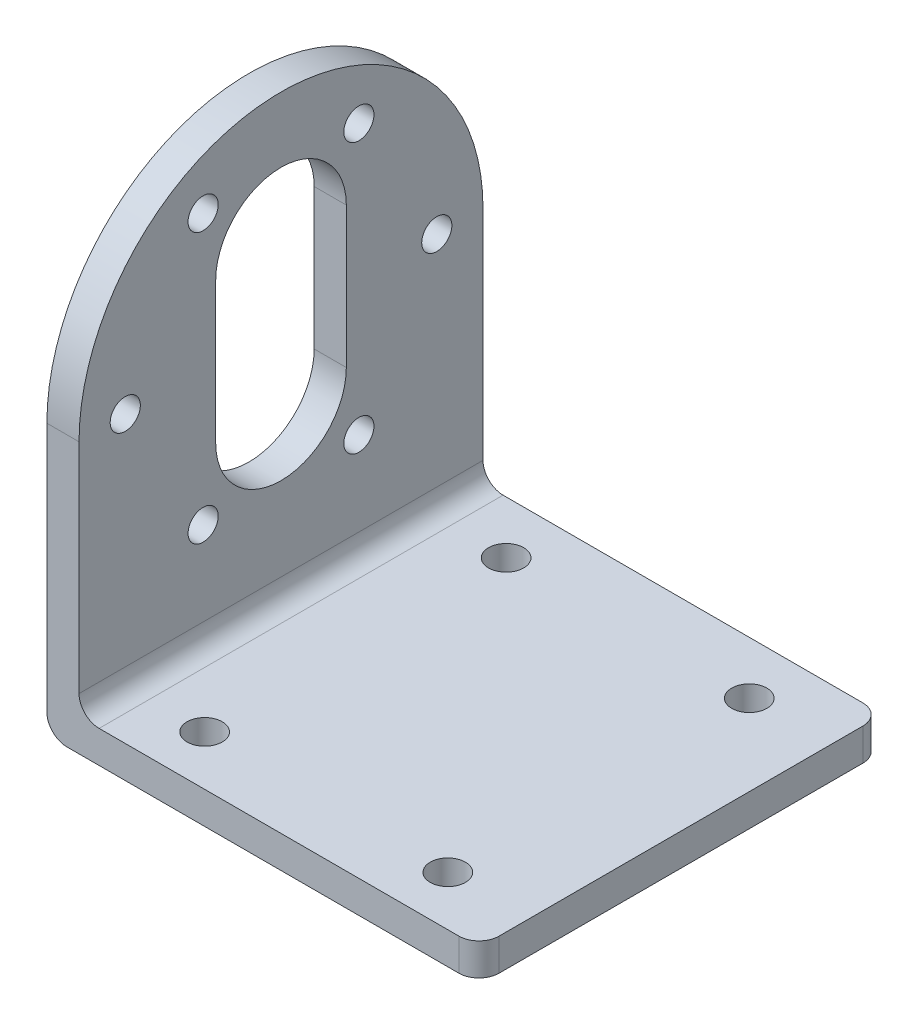
ISO-10303-21;
HEADER;
FILE_DESCRIPTION(('STEP AP214'),'2;1');
FILE_NAME('part.step','',(''),(''),'','','');
FILE_SCHEMA(('AUTOMOTIVE_DESIGN { 1 0 10303 214 1 1 1 1 }'));
ENDSEC;
DATA;
#1=APPLICATION_CONTEXT('core data for automotive mechanical design processes');
#2=APPLICATION_PROTOCOL_DEFINITION('international standard','automotive_design',2000,#1);
#3=PRODUCT_CONTEXT('',#1,'mechanical');
#4=PRODUCT('Part','Part','',(#3));
#5=PRODUCT_RELATED_PRODUCT_CATEGORY('part','',(#4));
#6=PRODUCT_DEFINITION_FORMATION('','',#4);
#7=PRODUCT_DEFINITION_CONTEXT('part definition',#1,'design');
#8=PRODUCT_DEFINITION('design','',#6,#7);
#9=PRODUCT_DEFINITION_SHAPE('','',#8);
#10=(LENGTH_UNIT() NAMED_UNIT(*) SI_UNIT(.MILLI.,.METRE.));
#11=(NAMED_UNIT(*) PLANE_ANGLE_UNIT() SI_UNIT($,.RADIAN.));
#12=(NAMED_UNIT(*) SI_UNIT($,.STERADIAN.) SOLID_ANGLE_UNIT());
#13=UNCERTAINTY_MEASURE_WITH_UNIT(LENGTH_MEASURE(1.E-05),#10,'distance_accuracy_value','');
#14=(GEOMETRIC_REPRESENTATION_CONTEXT(3) GLOBAL_UNCERTAINTY_ASSIGNED_CONTEXT((#13)) GLOBAL_UNIT_ASSIGNED_CONTEXT((#10,
#11,#12)) REPRESENTATION_CONTEXT('',''));
#15=CARTESIAN_POINT('',(0.,0.,0.));
#16=DIRECTION('',(0.,0.,1.));
#17=DIRECTION('',(1.,0.,0.));
#18=AXIS2_PLACEMENT_3D('',#15,#16,#17);
#19=CARTESIAN_POINT('',(-21.5,3.2,20.1));
#20=DIRECTION('',(1.,0.,0.));
#21=DIRECTION('',(0.,0.,-1.));
#22=AXIS2_PLACEMENT_3D('',#19,#20,#21);
#23=PLANE('',#22);
#24=CARTESIAN_POINT('',(-21.5,13.5766062413413,-7.75000000000016));
#25=DIRECTION('',(-1.,0.,0.));
#26=DIRECTION('',(0.,0.,1.));
#27=AXIS2_PLACEMENT_3D('',#24,#25,#26);
#28=CIRCLE('',#27,1.5);
#29=CARTESIAN_POINT('',(-21.5,13.5766062413413,-6.25000000000015));
#30=VERTEX_POINT('',#29);
#31=EDGE_CURVE('E294',#30,#30,#28,.T.);
#32=ORIENTED_EDGE('',*,*,#31,.F.);
#33=EDGE_LOOP('',(#32));
#34=FACE_BOUND('',#33,.T.);
#35=CARTESIAN_POINT('',(-21.5,13.5766062413411,7.74999999999987));
#36=DIRECTION('',(-1.,0.,0.));
#37=DIRECTION('',(0.,0.,1.));
#38=AXIS2_PLACEMENT_3D('',#35,#36,#37);
#39=CIRCLE('',#38,1.5);
#40=CARTESIAN_POINT('',(-21.5,13.5766062413411,9.24999999999987));
#41=VERTEX_POINT('',#40);
#42=EDGE_CURVE('E297',#41,#41,#39,.T.);
#43=ORIENTED_EDGE('',*,*,#42,.F.);
#44=EDGE_LOOP('',(#43));
#45=FACE_BOUND('',#44,.T.);
#46=CARTESIAN_POINT('',(-21.5,26.9999999999999,15.5));
#47=DIRECTION('',(-1.,0.,0.));
#48=DIRECTION('',(0.,0.,1.));
#49=AXIS2_PLACEMENT_3D('',#46,#47,#48);
#50=CIRCLE('',#49,1.5);
#51=CARTESIAN_POINT('',(-21.5,26.9999999999999,17.));
#52=VERTEX_POINT('',#51);
#53=EDGE_CURVE('E301',#52,#52,#50,.T.);
#54=ORIENTED_EDGE('',*,*,#53,.F.);
#55=EDGE_LOOP('',(#54));
#56=FACE_BOUND('',#55,.T.);
#57=CARTESIAN_POINT('',(-21.5,40.4233937586588,7.75000000000006));
#58=DIRECTION('',(-1.,0.,0.));
#59=DIRECTION('',(0.,0.,1.));
#60=AXIS2_PLACEMENT_3D('',#57,#58,#59);
#61=CIRCLE('',#60,1.5);
#62=CARTESIAN_POINT('',(-21.5,40.4233937586588,9.25000000000006));
#63=VERTEX_POINT('',#62);
#64=EDGE_CURVE('E304',#63,#63,#61,.T.);
#65=ORIENTED_EDGE('',*,*,#64,.F.);
#66=EDGE_LOOP('',(#65));
#67=FACE_BOUND('',#66,.T.);
#68=CARTESIAN_POINT('',(-21.5,40.4233937586588,-7.74999999999998));
#69=DIRECTION('',(-1.,0.,0.));
#70=DIRECTION('',(0.,0.,1.));
#71=AXIS2_PLACEMENT_3D('',#68,#69,#70);
#72=CIRCLE('',#71,1.5);
#73=CARTESIAN_POINT('',(-21.5,40.4233937586588,-6.24999999999998));
#74=VERTEX_POINT('',#73);
#75=EDGE_CURVE('E307',#74,#74,#72,.T.);
#76=ORIENTED_EDGE('',*,*,#75,.F.);
#77=EDGE_LOOP('',(#76));
#78=FACE_BOUND('',#77,.T.);
#79=CARTESIAN_POINT('',(-21.5,27.,-15.5));
#80=DIRECTION('',(-1.,0.,0.));
#81=DIRECTION('',(0.,0.,1.));
#82=AXIS2_PLACEMENT_3D('',#79,#80,#81);
#83=CIRCLE('',#82,1.5);
#84=CARTESIAN_POINT('',(-21.5,27.,-14.));
#85=VERTEX_POINT('',#84);
#86=EDGE_CURVE('E293',#85,#85,#83,.T.);
#87=ORIENTED_EDGE('',*,*,#86,.F.);
#88=EDGE_LOOP('',(#87));
#89=FACE_BOUND('',#88,.T.);
#90=DIRECTION('',(0.,-1.,0.));
#91=VECTOR('',#90,1.);
#92=CARTESIAN_POINT('',(-21.5,34.,-6.5));
#93=LINE('',#92,#91);
#94=CARTESIAN_POINT('',(-21.5,34.,-6.5));
#95=VERTEX_POINT('',#94);
#96=CARTESIAN_POINT('',(-21.5,20.,-6.5));
#97=VERTEX_POINT('',#96);
#98=EDGE_CURVE('E288',#95,#97,#93,.T.);
#99=ORIENTED_EDGE('',*,*,#98,.F.);
#100=CARTESIAN_POINT('',(-21.5,34.,0.));
#101=DIRECTION('',(-1.,0.,0.));
#102=DIRECTION('',(0.,0.,1.));
#103=AXIS2_PLACEMENT_3D('',#100,#101,#102);
#104=CIRCLE('',#103,6.5);
#105=CARTESIAN_POINT('',(-21.5,34.,6.5));
#106=VERTEX_POINT('',#105);
#107=EDGE_CURVE('E291',#106,#95,#104,.T.);
#108=ORIENTED_EDGE('',*,*,#107,.F.);
#109=DIRECTION('',(0.,1.,0.));
#110=VECTOR('',#109,1.);
#111=CARTESIAN_POINT('',(-21.5,34.,6.5));
#112=LINE('',#111,#110);
#113=CARTESIAN_POINT('',(-21.5,20.,6.5));
#114=VERTEX_POINT('',#113);
#115=EDGE_CURVE('E278',#114,#106,#112,.T.);
#116=ORIENTED_EDGE('',*,*,#115,.F.);
#117=CARTESIAN_POINT('',(-21.5,20.,0.));
#118=DIRECTION('',(-1.,0.,0.));
#119=DIRECTION('',(0.,0.,1.));
#120=AXIS2_PLACEMENT_3D('',#117,#118,#119);
#121=CIRCLE('',#120,6.5);
#122=EDGE_CURVE('E285',#97,#114,#121,.T.);
#123=ORIENTED_EDGE('',*,*,#122,.F.);
#124=EDGE_LOOP('',(#99,#108,#116,#123));
#125=FACE_BOUND('',#124,.T.);
#126=DIRECTION('',(0.,-1.,0.));
#127=VECTOR('',#126,1.);
#128=CARTESIAN_POINT('',(-21.5,3.2,-20.1));
#129=LINE('',#128,#127);
#130=CARTESIAN_POINT('',(-21.5,26.9,-20.1));
#131=VERTEX_POINT('',#130);
#132=CARTESIAN_POINT('',(-21.5,2.,-20.1));
#133=VERTEX_POINT('',#132);
#134=EDGE_CURVE('E168',#131,#133,#129,.T.);
#135=ORIENTED_EDGE('',*,*,#134,.T.);
#136=DIRECTION('',(0.,0.,1.));
#137=VECTOR('',#136,1.);
#138=CARTESIAN_POINT('',(-21.5,2.,20.1));
#139=LINE('',#138,#137);
#140=CARTESIAN_POINT('',(-21.5,2.,20.1));
#141=VERTEX_POINT('',#140);
#142=EDGE_CURVE('E162',#133,#141,#139,.T.);
#143=ORIENTED_EDGE('',*,*,#142,.T.);
#144=DIRECTION('',(0.,-1.,0.));
#145=VECTOR('',#144,1.);
#146=CARTESIAN_POINT('',(-21.5,3.2,20.1));
#147=LINE('',#146,#145);
#148=CARTESIAN_POINT('',(-21.5,26.9,20.1));
#149=VERTEX_POINT('',#148);
#150=EDGE_CURVE('E159',#149,#141,#147,.T.);
#151=ORIENTED_EDGE('',*,*,#150,.F.);
#152=CARTESIAN_POINT('',(-21.5,26.9,0.));
#153=DIRECTION('',(-1.,0.,0.));
#154=DIRECTION('',(0.,0.,1.));
#155=AXIS2_PLACEMENT_3D('',#152,#153,#154);
#156=CIRCLE('',#155,20.1);
#157=EDGE_CURVE('E144',#149,#131,#156,.T.);
#158=ORIENTED_EDGE('',*,*,#157,.T.);
#159=EDGE_LOOP('',(#135,#143,#151,#158));
#160=FACE_BOUND('',#159,.T.);
#161=ADVANCED_FACE('F41',(#34,#45,#56,#67,#78,#89,#125,#160),#23,.F.);
#162=CARTESIAN_POINT('',(-18.3,47.,0.));
#163=DIRECTION('',(1.,0.,0.));
#164=DIRECTION('',(0.,0.,-1.));
#165=AXIS2_PLACEMENT_3D('',#162,#163,#164);
#166=PLANE('',#165);
#167=CARTESIAN_POINT('',(-18.3,13.5766062413413,-7.75000000000016));
#168=DIRECTION('',(1.,0.,0.));
#169=DIRECTION('',(0.,0.,-1.));
#170=AXIS2_PLACEMENT_3D('',#167,#168,#169);
#171=CIRCLE('',#170,1.5);
#172=CARTESIAN_POINT('',(-18.3,13.5766062413413,-9.25000000000016));
#173=VERTEX_POINT('',#172);
#174=EDGE_CURVE('E197',#173,#173,#171,.T.);
#175=ORIENTED_EDGE('',*,*,#174,.F.);
#176=EDGE_LOOP('',(#175));
#177=FACE_BOUND('',#176,.T.);
#178=CARTESIAN_POINT('',(-18.3,13.5766062413411,7.74999999999987));
#179=DIRECTION('',(1.,0.,0.));
#180=DIRECTION('',(0.,0.,-1.));
#181=AXIS2_PLACEMENT_3D('',#178,#179,#180);
#182=CIRCLE('',#181,1.5);
#183=CARTESIAN_POINT('',(-18.3,13.5766062413411,6.24999999999988));
#184=VERTEX_POINT('',#183);
#185=EDGE_CURVE('E194',#184,#184,#182,.T.);
#186=ORIENTED_EDGE('',*,*,#185,.F.);
#187=EDGE_LOOP('',(#186));
#188=FACE_BOUND('',#187,.T.);
#189=CARTESIAN_POINT('',(-18.3,26.9999999999999,15.5));
#190=DIRECTION('',(1.,0.,0.));
#191=DIRECTION('',(0.,0.,-1.));
#192=AXIS2_PLACEMENT_3D('',#189,#190,#191);
#193=CIRCLE('',#192,1.5);
#194=CARTESIAN_POINT('',(-18.3,26.9999999999999,14.));
#195=VERTEX_POINT('',#194);
#196=EDGE_CURVE('E191',#195,#195,#193,.T.);
#197=ORIENTED_EDGE('',*,*,#196,.F.);
#198=EDGE_LOOP('',(#197));
#199=FACE_BOUND('',#198,.T.);
#200=CARTESIAN_POINT('',(-18.3,40.4233937586588,7.75000000000006));
#201=DIRECTION('',(1.,0.,0.));
#202=DIRECTION('',(0.,0.,-1.));
#203=AXIS2_PLACEMENT_3D('',#200,#201,#202);
#204=CIRCLE('',#203,1.5);
#205=CARTESIAN_POINT('',(-18.3,40.4233937586588,6.25000000000006));
#206=VERTEX_POINT('',#205);
#207=EDGE_CURVE('E188',#206,#206,#204,.T.);
#208=ORIENTED_EDGE('',*,*,#207,.F.);
#209=EDGE_LOOP('',(#208));
#210=FACE_BOUND('',#209,.T.);
#211=CARTESIAN_POINT('',(-18.3,40.4233937586588,-7.74999999999998));
#212=DIRECTION('',(1.,0.,0.));
#213=DIRECTION('',(0.,0.,-1.));
#214=AXIS2_PLACEMENT_3D('',#211,#212,#213);
#215=CIRCLE('',#214,1.5);
#216=CARTESIAN_POINT('',(-18.3,40.4233937586588,-9.24999999999998));
#217=VERTEX_POINT('',#216);
#218=EDGE_CURVE('E184',#217,#217,#215,.T.);
#219=ORIENTED_EDGE('',*,*,#218,.F.);
#220=EDGE_LOOP('',(#219));
#221=FACE_BOUND('',#220,.T.);
#222=CARTESIAN_POINT('',(-18.3,27.,-15.5));
#223=DIRECTION('',(1.,0.,0.));
#224=DIRECTION('',(0.,0.,-1.));
#225=AXIS2_PLACEMENT_3D('',#222,#223,#224);
#226=CIRCLE('',#225,1.5);
#227=CARTESIAN_POINT('',(-18.3,27.,-17.));
#228=VERTEX_POINT('',#227);
#229=EDGE_CURVE('E181',#228,#228,#226,.T.);
#230=ORIENTED_EDGE('',*,*,#229,.F.);
#231=EDGE_LOOP('',(#230));
#232=FACE_BOUND('',#231,.T.);
#233=CARTESIAN_POINT('',(-18.3,34.,0.));
#234=DIRECTION('',(1.,0.,0.));
#235=DIRECTION('',(0.,0.,-1.));
#236=AXIS2_PLACEMENT_3D('',#233,#234,#235);
#237=CIRCLE('',#236,6.5);
#238=CARTESIAN_POINT('',(-18.3,34.,-6.5));
#239=VERTEX_POINT('',#238);
#240=CARTESIAN_POINT('',(-18.3,34.,6.5));
#241=VERTEX_POINT('',#240);
#242=EDGE_CURVE('E163',#239,#241,#237,.T.);
#243=ORIENTED_EDGE('',*,*,#242,.F.);
#244=DIRECTION('',(0.,1.,0.));
#245=VECTOR('',#244,1.);
#246=CARTESIAN_POINT('',(-18.3,47.,-6.5));
#247=LINE('',#246,#245);
#248=CARTESIAN_POINT('',(-18.3,20.,-6.5));
#249=VERTEX_POINT('',#248);
#250=EDGE_CURVE('E167',#249,#239,#247,.T.);
#251=ORIENTED_EDGE('',*,*,#250,.F.);
#252=CARTESIAN_POINT('',(-18.3,20.,0.));
#253=DIRECTION('',(1.,0.,0.));
#254=DIRECTION('',(0.,0.,-1.));
#255=AXIS2_PLACEMENT_3D('',#252,#253,#254);
#256=CIRCLE('',#255,6.5);
#257=CARTESIAN_POINT('',(-18.3,20.,6.5));
#258=VERTEX_POINT('',#257);
#259=EDGE_CURVE('E170',#258,#249,#256,.T.);
#260=ORIENTED_EDGE('',*,*,#259,.F.);
#261=DIRECTION('',(0.,-1.,0.));
#262=VECTOR('',#261,1.);
#263=CARTESIAN_POINT('',(-18.3,47.,6.5));
#264=LINE('',#263,#262);
#265=EDGE_CURVE('E178',#241,#258,#264,.T.);
#266=ORIENTED_EDGE('',*,*,#265,.F.);
#267=EDGE_LOOP('',(#243,#251,#260,#266));
#268=FACE_BOUND('',#267,.T.);
#269=DIRECTION('',(0.,-1.,0.));
#270=VECTOR('',#269,1.);
#271=CARTESIAN_POINT('',(-18.3,47.,20.1));
#272=LINE('',#271,#270);
#273=CARTESIAN_POINT('',(-18.3,26.9,20.1));
#274=VERTEX_POINT('',#273);
#275=CARTESIAN_POINT('',(-18.3,5.2,20.1));
#276=VERTEX_POINT('',#275);
#277=EDGE_CURVE('E161',#274,#276,#272,.T.);
#278=ORIENTED_EDGE('',*,*,#277,.T.);
#279=DIRECTION('',(0.,0.,1.));
#280=VECTOR('',#279,1.);
#281=CARTESIAN_POINT('',(-18.3,5.2,-20.1));
#282=LINE('',#281,#280);
#283=CARTESIAN_POINT('',(-18.3,5.2,-20.1));
#284=VERTEX_POINT('',#283);
#285=EDGE_CURVE('E211',#276,#284,#282,.F.);
#286=ORIENTED_EDGE('',*,*,#285,.T.);
#287=DIRECTION('',(0.,-1.,0.));
#288=VECTOR('',#287,1.);
#289=CARTESIAN_POINT('',(-18.3,47.,-20.1));
#290=LINE('',#289,#288);
#291=CARTESIAN_POINT('',(-18.3,26.9,-20.1));
#292=VERTEX_POINT('',#291);
#293=EDGE_CURVE('E267',#292,#284,#290,.T.);
#294=ORIENTED_EDGE('',*,*,#293,.F.);
#295=CARTESIAN_POINT('',(-18.3,26.9,0.));
#296=DIRECTION('',(1.,0.,0.));
#297=DIRECTION('',(0.,0.,-1.));
#298=AXIS2_PLACEMENT_3D('',#295,#296,#297);
#299=CIRCLE('',#298,20.1);
#300=EDGE_CURVE('E298',#292,#274,#299,.T.);
#301=ORIENTED_EDGE('',*,*,#300,.T.);
#302=EDGE_LOOP('',(#278,#286,#294,#301));
#303=FACE_BOUND('',#302,.T.);
#304=ADVANCED_FACE('F357',(#177,#188,#199,#210,#221,#232,#268,#303),#166,.T.);
#305=CARTESIAN_POINT('',(21.5,3.2,-20.1));
#306=DIRECTION('',(0.,0.,1.));
#307=DIRECTION('',(1.,0.,0.));
#308=AXIS2_PLACEMENT_3D('',#305,#306,#307);
#309=PLANE('',#308);
#310=DIRECTION('',(-1.,0.,0.));
#311=VECTOR('',#310,1.);
#312=CARTESIAN_POINT('',(21.5,3.2,-20.1));
#313=LINE('',#312,#311);
#314=CARTESIAN_POINT('',(19.5,3.2,-20.1));
#315=VERTEX_POINT('',#314);
#316=CARTESIAN_POINT('',(-16.3,3.2,-20.1));
#317=VERTEX_POINT('',#316);
#318=EDGE_CURVE('E172',#315,#317,#313,.T.);
#319=ORIENTED_EDGE('',*,*,#318,.F.);
#320=DIRECTION('',(0.,-1.,0.));
#321=VECTOR('',#320,1.);
#322=CARTESIAN_POINT('',(19.5,3.2,-20.1));
#323=LINE('',#322,#321);
#324=CARTESIAN_POINT('',(19.5,0.,-20.1));
#325=VERTEX_POINT('',#324);
#326=EDGE_CURVE('E218',#315,#325,#323,.T.);
#327=ORIENTED_EDGE('',*,*,#326,.T.);
#328=DIRECTION('',(-1.,0.,0.));
#329=VECTOR('',#328,1.);
#330=CARTESIAN_POINT('',(21.5,0.,-20.1));
#331=LINE('',#330,#329);
#332=CARTESIAN_POINT('',(-19.5,0.,-20.1));
#333=VERTEX_POINT('',#332);
#334=EDGE_CURVE('E261',#325,#333,#331,.T.);
#335=ORIENTED_EDGE('',*,*,#334,.T.);
#336=CARTESIAN_POINT('',(-19.5,2.,-20.1));
#337=DIRECTION('',(0.,0.,1.));
#338=DIRECTION('',(1.,0.,0.));
#339=AXIS2_PLACEMENT_3D('',#336,#337,#338);
#340=CIRCLE('',#339,2.);
#341=EDGE_CURVE('E206',#333,#133,#340,.F.);
#342=ORIENTED_EDGE('',*,*,#341,.T.);
#343=ORIENTED_EDGE('',*,*,#134,.F.);
#344=DIRECTION('',(-1.,0.,0.));
#345=VECTOR('',#344,1.);
#346=CARTESIAN_POINT('',(22.3,26.9,-20.1));
#347=LINE('',#346,#345);
#348=EDGE_CURVE('E150',#292,#131,#347,.T.);
#349=ORIENTED_EDGE('',*,*,#348,.F.);
#350=ORIENTED_EDGE('',*,*,#293,.T.);
#351=CARTESIAN_POINT('',(-16.3,5.2,-20.1));
#352=DIRECTION('',(0.,0.,1.));
#353=DIRECTION('',(1.,0.,0.));
#354=AXIS2_PLACEMENT_3D('',#351,#352,#353);
#355=CIRCLE('',#354,2.);
#356=EDGE_CURVE('E215',#284,#317,#355,.T.);
#357=ORIENTED_EDGE('',*,*,#356,.T.);
#358=EDGE_LOOP('',(#319,#327,#335,#342,#343,#349,#350,#357));
#359=FACE_BOUND('',#358,.T.);
#360=ADVANCED_FACE('F250',(#359),#309,.F.);
#361=CARTESIAN_POINT('',(0.,3.2,0.));
#362=DIRECTION('',(0.,1.,0.));
#363=DIRECTION('',(0.,0.,1.));
#364=AXIS2_PLACEMENT_3D('',#361,#362,#363);
#365=PLANE('',#364);
#366=CARTESIAN_POINT('',(13.45,3.2,15.15));
#367=DIRECTION('',(0.,1.,0.));
#368=DIRECTION('',(0.,0.,1.));
#369=AXIS2_PLACEMENT_3D('',#366,#367,#368);
#370=CIRCLE('',#369,1.75);
#371=CARTESIAN_POINT('',(13.45,3.2,16.9));
#372=VERTEX_POINT('',#371);
#373=EDGE_CURVE('E316',#372,#372,#370,.T.);
#374=ORIENTED_EDGE('',*,*,#373,.F.);
#375=EDGE_LOOP('',(#374));
#376=FACE_BOUND('',#375,.T.);
#377=CARTESIAN_POINT('',(-10.75,3.2,-14.85));
#378=DIRECTION('',(0.,1.,0.));
#379=DIRECTION('',(0.,0.,1.));
#380=AXIS2_PLACEMENT_3D('',#377,#378,#379);
#381=CIRCLE('',#380,1.75);
#382=CARTESIAN_POINT('',(-10.75,3.2,-13.1));
#383=VERTEX_POINT('',#382);
#384=EDGE_CURVE('E317',#383,#383,#381,.T.);
#385=ORIENTED_EDGE('',*,*,#384,.F.);
#386=EDGE_LOOP('',(#385));
#387=FACE_BOUND('',#386,.T.);
#388=CARTESIAN_POINT('',(-10.75,3.2,15.15));
#389=DIRECTION('',(0.,1.,0.));
#390=DIRECTION('',(0.,0.,1.));
#391=AXIS2_PLACEMENT_3D('',#388,#389,#390);
#392=CIRCLE('',#391,1.75);
#393=CARTESIAN_POINT('',(-10.75,3.2,16.9));
#394=VERTEX_POINT('',#393);
#395=EDGE_CURVE('E320',#394,#394,#392,.T.);
#396=ORIENTED_EDGE('',*,*,#395,.F.);
#397=EDGE_LOOP('',(#396));
#398=FACE_BOUND('',#397,.T.);
#399=CARTESIAN_POINT('',(13.45,3.2,-14.85));
#400=DIRECTION('',(0.,1.,0.));
#401=DIRECTION('',(0.,0.,1.));
#402=AXIS2_PLACEMENT_3D('',#399,#400,#401);
#403=CIRCLE('',#402,1.75);
#404=CARTESIAN_POINT('',(13.45,3.2,-13.1));
#405=VERTEX_POINT('',#404);
#406=EDGE_CURVE('E223',#405,#405,#403,.T.);
#407=ORIENTED_EDGE('',*,*,#406,.F.);
#408=EDGE_LOOP('',(#407));
#409=FACE_BOUND('',#408,.T.);
#410=DIRECTION('',(0.,0.,-1.));
#411=VECTOR('',#410,1.);
#412=CARTESIAN_POINT('',(21.5,3.2,20.1));
#413=LINE('',#412,#411);
#414=CARTESIAN_POINT('',(21.5,3.2,18.1));
#415=VERTEX_POINT('',#414);
#416=CARTESIAN_POINT('',(21.5,3.2,-18.1));
#417=VERTEX_POINT('',#416);
#418=EDGE_CURVE('E246',#415,#417,#413,.T.);
#419=ORIENTED_EDGE('',*,*,#418,.T.);
#420=CARTESIAN_POINT('',(19.5,3.2,-18.1));
#421=DIRECTION('',(0.,1.,0.));
#422=DIRECTION('',(0.,0.,1.));
#423=AXIS2_PLACEMENT_3D('',#420,#421,#422);
#424=CIRCLE('',#423,2.);
#425=EDGE_CURVE('E49',#417,#315,#424,.T.);
#426=ORIENTED_EDGE('',*,*,#425,.T.);
#427=ORIENTED_EDGE('',*,*,#318,.T.);
#428=DIRECTION('',(0.,0.,1.));
#429=VECTOR('',#428,1.);
#430=CARTESIAN_POINT('',(-16.3,3.2,20.1));
#431=LINE('',#430,#429);
#432=CARTESIAN_POINT('',(-16.3,3.2,20.1));
#433=VERTEX_POINT('',#432);
#434=EDGE_CURVE('E208',#317,#433,#431,.T.);
#435=ORIENTED_EDGE('',*,*,#434,.T.);
#436=DIRECTION('',(1.,0.,0.));
#437=VECTOR('',#436,1.);
#438=CARTESIAN_POINT('',(21.5,3.2,20.1));
#439=LINE('',#438,#437);
#440=CARTESIAN_POINT('',(19.5,3.2,20.1));
#441=VERTEX_POINT('',#440);
#442=EDGE_CURVE('E266',#433,#441,#439,.T.);
#443=ORIENTED_EDGE('',*,*,#442,.T.);
#444=CARTESIAN_POINT('',(19.5,3.2,18.1));
#445=DIRECTION('',(0.,1.,0.));
#446=DIRECTION('',(0.,0.,1.));
#447=AXIS2_PLACEMENT_3D('',#444,#445,#446);
#448=CIRCLE('',#447,2.);
#449=EDGE_CURVE('E241',#441,#415,#448,.T.);
#450=ORIENTED_EDGE('',*,*,#449,.T.);
#451=EDGE_LOOP('',(#419,#426,#427,#435,#443,#450));
#452=FACE_BOUND('',#451,.T.);
#453=ADVANCED_FACE('F245',(#376,#387,#398,#409,#452),#365,.T.);
#454=CARTESIAN_POINT('',(21.5,3.2,20.1));
#455=DIRECTION('',(0.,0.,-1.));
#456=DIRECTION('',(-1.,0.,0.));
#457=AXIS2_PLACEMENT_3D('',#454,#455,#456);
#458=PLANE('',#457);
#459=DIRECTION('',(1.,0.,0.));
#460=VECTOR('',#459,1.);
#461=CARTESIAN_POINT('',(21.5,0.,20.1));
#462=LINE('',#461,#460);
#463=CARTESIAN_POINT('',(-19.5,0.,20.1));
#464=VERTEX_POINT('',#463);
#465=CARTESIAN_POINT('',(19.5,0.,20.1));
#466=VERTEX_POINT('',#465);
#467=EDGE_CURVE('E264',#464,#466,#462,.T.);
#468=ORIENTED_EDGE('',*,*,#467,.T.);
#469=DIRECTION('',(0.,-1.,0.));
#470=VECTOR('',#469,1.);
#471=CARTESIAN_POINT('',(19.5,3.2,20.1));
#472=LINE('',#471,#470);
#473=EDGE_CURVE('E11',#466,#441,#472,.F.);
#474=ORIENTED_EDGE('',*,*,#473,.T.);
#475=ORIENTED_EDGE('',*,*,#442,.F.);
#476=CARTESIAN_POINT('',(-16.3,5.2,20.1));
#477=DIRECTION('',(0.,0.,-1.));
#478=DIRECTION('',(-1.,0.,0.));
#479=AXIS2_PLACEMENT_3D('',#476,#477,#478);
#480=CIRCLE('',#479,2.);
#481=EDGE_CURVE('E213',#433,#276,#480,.T.);
#482=ORIENTED_EDGE('',*,*,#481,.T.);
#483=ORIENTED_EDGE('',*,*,#277,.F.);
#484=DIRECTION('',(-1.,0.,0.));
#485=VECTOR('',#484,1.);
#486=CARTESIAN_POINT('',(22.3,26.9,20.1));
#487=LINE('',#486,#485);
#488=EDGE_CURVE('E147',#274,#149,#487,.T.);
#489=ORIENTED_EDGE('',*,*,#488,.T.);
#490=ORIENTED_EDGE('',*,*,#150,.T.);
#491=CARTESIAN_POINT('',(-19.5,2.,20.1));
#492=DIRECTION('',(0.,0.,-1.));
#493=DIRECTION('',(-1.,0.,0.));
#494=AXIS2_PLACEMENT_3D('',#491,#492,#493);
#495=CIRCLE('',#494,2.);
#496=EDGE_CURVE('E201',#141,#464,#495,.F.);
#497=ORIENTED_EDGE('',*,*,#496,.T.);
#498=EDGE_LOOP('',(#468,#474,#475,#482,#483,#489,#490,#497));
#499=FACE_BOUND('',#498,.T.);
#500=ADVANCED_FACE('F158',(#499),#458,.F.);
#501=CARTESIAN_POINT('',(21.5,3.2,20.1));
#502=DIRECTION('',(-1.,0.,0.));
#503=DIRECTION('',(0.,0.,1.));
#504=AXIS2_PLACEMENT_3D('',#501,#502,#503);
#505=PLANE('',#504);
#506=DIRECTION('',(0.,0.,-1.));
#507=VECTOR('',#506,1.);
#508=CARTESIAN_POINT('',(21.5,0.,20.1));
#509=LINE('',#508,#507);
#510=CARTESIAN_POINT('',(21.5,0.,18.1));
#511=VERTEX_POINT('',#510);
#512=CARTESIAN_POINT('',(21.5,0.,-18.1));
#513=VERTEX_POINT('',#512);
#514=EDGE_CURVE('E260',#511,#513,#509,.T.);
#515=ORIENTED_EDGE('',*,*,#514,.T.);
#516=DIRECTION('',(0.,-1.,0.));
#517=VECTOR('',#516,1.);
#518=CARTESIAN_POINT('',(21.5,3.2,-18.1));
#519=LINE('',#518,#517);
#520=EDGE_CURVE('E62',#513,#417,#519,.F.);
#521=ORIENTED_EDGE('',*,*,#520,.T.);
#522=ORIENTED_EDGE('',*,*,#418,.F.);
#523=DIRECTION('',(0.,-1.,0.));
#524=VECTOR('',#523,1.);
#525=CARTESIAN_POINT('',(21.5,3.2,18.1));
#526=LINE('',#525,#524);
#527=EDGE_CURVE('E237',#415,#511,#526,.T.);
#528=ORIENTED_EDGE('',*,*,#527,.T.);
#529=EDGE_LOOP('',(#515,#521,#522,#528));
#530=FACE_BOUND('',#529,.T.);
#531=ADVANCED_FACE('F262',(#530),#505,.F.);
#532=CARTESIAN_POINT('',(0.,0.,0.));
#533=DIRECTION('',(0.,1.,0.));
#534=DIRECTION('',(0.,0.,1.));
#535=AXIS2_PLACEMENT_3D('',#532,#533,#534);
#536=PLANE('',#535);
#537=CARTESIAN_POINT('',(13.45,0.,15.15));
#538=DIRECTION('',(0.,1.,0.));
#539=DIRECTION('',(0.,0.,1.));
#540=AXIS2_PLACEMENT_3D('',#537,#538,#539);
#541=CIRCLE('',#540,1.75);
#542=CARTESIAN_POINT('',(13.45,0.,16.9));
#543=VERTEX_POINT('',#542);
#544=EDGE_CURVE('E155',#543,#543,#541,.T.);
#545=ORIENTED_EDGE('',*,*,#544,.T.);
#546=EDGE_LOOP('',(#545));
#547=FACE_BOUND('',#546,.T.);
#548=CARTESIAN_POINT('',(-10.75,0.,-14.85));
#549=DIRECTION('',(0.,1.,0.));
#550=DIRECTION('',(0.,0.,1.));
#551=AXIS2_PLACEMENT_3D('',#548,#549,#550);
#552=CIRCLE('',#551,1.75);
#553=CARTESIAN_POINT('',(-10.75,0.,-13.1));
#554=VERTEX_POINT('',#553);
#555=EDGE_CURVE('E226',#554,#554,#552,.T.);
#556=ORIENTED_EDGE('',*,*,#555,.T.);
#557=EDGE_LOOP('',(#556));
#558=FACE_BOUND('',#557,.T.);
#559=CARTESIAN_POINT('',(-10.75,0.,15.15));
#560=DIRECTION('',(0.,1.,0.));
#561=DIRECTION('',(0.,0.,1.));
#562=AXIS2_PLACEMENT_3D('',#559,#560,#561);
#563=CIRCLE('',#562,1.75);
#564=CARTESIAN_POINT('',(-10.75,0.,16.9));
#565=VERTEX_POINT('',#564);
#566=EDGE_CURVE('E222',#565,#565,#563,.T.);
#567=ORIENTED_EDGE('',*,*,#566,.T.);
#568=EDGE_LOOP('',(#567));
#569=FACE_BOUND('',#568,.T.);
#570=CARTESIAN_POINT('',(13.45,0.,-14.85));
#571=DIRECTION('',(0.,1.,0.));
#572=DIRECTION('',(0.,0.,1.));
#573=AXIS2_PLACEMENT_3D('',#570,#571,#572);
#574=CIRCLE('',#573,1.75);
#575=CARTESIAN_POINT('',(13.45,0.,-13.1));
#576=VERTEX_POINT('',#575);
#577=EDGE_CURVE('E219',#576,#576,#574,.T.);
#578=ORIENTED_EDGE('',*,*,#577,.T.);
#579=EDGE_LOOP('',(#578));
#580=FACE_BOUND('',#579,.T.);
#581=ORIENTED_EDGE('',*,*,#334,.F.);
#582=CARTESIAN_POINT('',(19.5,0.,-18.1));
#583=DIRECTION('',(0.,1.,0.));
#584=DIRECTION('',(0.,0.,1.));
#585=AXIS2_PLACEMENT_3D('',#582,#583,#584);
#586=CIRCLE('',#585,2.);
#587=EDGE_CURVE('E235',#325,#513,#586,.F.);
#588=ORIENTED_EDGE('',*,*,#587,.T.);
#589=ORIENTED_EDGE('',*,*,#514,.F.);
#590=CARTESIAN_POINT('',(19.5,0.,18.1));
#591=DIRECTION('',(0.,1.,0.));
#592=DIRECTION('',(0.,0.,1.));
#593=AXIS2_PLACEMENT_3D('',#590,#591,#592);
#594=CIRCLE('',#593,2.);
#595=EDGE_CURVE('E233',#511,#466,#594,.F.);
#596=ORIENTED_EDGE('',*,*,#595,.T.);
#597=ORIENTED_EDGE('',*,*,#467,.F.);
#598=DIRECTION('',(0.,0.,1.));
#599=VECTOR('',#598,1.);
#600=CARTESIAN_POINT('',(-19.5,0.,0.));
#601=LINE('',#600,#599);
#602=EDGE_CURVE('E203',#464,#333,#601,.F.);
#603=ORIENTED_EDGE('',*,*,#602,.T.);
#604=EDGE_LOOP('',(#581,#588,#589,#596,#597,#603));
#605=FACE_BOUND('',#604,.T.);
#606=ADVANCED_FACE('F259',(#547,#558,#569,#580,#605),#536,.F.);
#607=CARTESIAN_POINT('',(22.3,34.,0.));
#608=DIRECTION('',(-1.,0.,0.));
#609=DIRECTION('',(0.,0.,1.));
#610=AXIS2_PLACEMENT_3D('',#607,#608,#609);
#611=CYLINDRICAL_SURFACE('',#610,6.5);
#612=ORIENTED_EDGE('',*,*,#242,.T.);
#613=DIRECTION('',(-1.,0.,0.));
#614=VECTOR('',#613,1.);
#615=CARTESIAN_POINT('',(22.3,34.,6.5));
#616=LINE('',#615,#614);
#617=EDGE_CURVE('E185',#241,#106,#616,.T.);
#618=ORIENTED_EDGE('',*,*,#617,.T.);
#619=ORIENTED_EDGE('',*,*,#107,.T.);
#620=DIRECTION('',(-1.,0.,0.));
#621=VECTOR('',#620,1.);
#622=CARTESIAN_POINT('',(22.3,34.,-6.5));
#623=LINE('',#622,#621);
#624=EDGE_CURVE('E274',#239,#95,#623,.T.);
#625=ORIENTED_EDGE('',*,*,#624,.F.);
#626=EDGE_LOOP('',(#612,#618,#619,#625));
#627=FACE_BOUND('',#626,.T.);
#628=ADVANCED_FACE('F343',(#627),#611,.F.);
#629=CARTESIAN_POINT('',(22.3,34.,6.5));
#630=DIRECTION('',(0.,0.,1.));
#631=DIRECTION('',(0.,-1.,0.));
#632=AXIS2_PLACEMENT_3D('',#629,#630,#631);
#633=PLANE('',#632);
#634=ORIENTED_EDGE('',*,*,#265,.T.);
#635=DIRECTION('',(-1.,0.,0.));
#636=VECTOR('',#635,1.);
#637=CARTESIAN_POINT('',(22.3,20.,6.5));
#638=LINE('',#637,#636);
#639=EDGE_CURVE('E280',#258,#114,#638,.T.);
#640=ORIENTED_EDGE('',*,*,#639,.T.);
#641=ORIENTED_EDGE('',*,*,#115,.T.);
#642=ORIENTED_EDGE('',*,*,#617,.F.);
#643=EDGE_LOOP('',(#634,#640,#641,#642));
#644=FACE_BOUND('',#643,.T.);
#645=ADVANCED_FACE('F350',(#644),#633,.F.);
#646=CARTESIAN_POINT('',(22.3,20.,0.));
#647=DIRECTION('',(-1.,0.,0.));
#648=DIRECTION('',(0.,0.,1.));
#649=AXIS2_PLACEMENT_3D('',#646,#647,#648);
#650=CYLINDRICAL_SURFACE('',#649,6.5);
#651=ORIENTED_EDGE('',*,*,#259,.T.);
#652=DIRECTION('',(-1.,0.,0.));
#653=VECTOR('',#652,1.);
#654=CARTESIAN_POINT('',(22.3,20.,-6.5));
#655=LINE('',#654,#653);
#656=EDGE_CURVE('E277',#249,#97,#655,.T.);
#657=ORIENTED_EDGE('',*,*,#656,.T.);
#658=ORIENTED_EDGE('',*,*,#122,.T.);
#659=ORIENTED_EDGE('',*,*,#639,.F.);
#660=EDGE_LOOP('',(#651,#657,#658,#659));
#661=FACE_BOUND('',#660,.T.);
#662=ADVANCED_FACE('F422',(#661),#650,.F.);
#663=CARTESIAN_POINT('',(22.3,34.,-6.5));
#664=DIRECTION('',(0.,0.,-1.));
#665=DIRECTION('',(0.,1.,0.));
#666=AXIS2_PLACEMENT_3D('',#663,#664,#665);
#667=PLANE('',#666);
#668=ORIENTED_EDGE('',*,*,#250,.T.);
#669=ORIENTED_EDGE('',*,*,#624,.T.);
#670=ORIENTED_EDGE('',*,*,#98,.T.);
#671=ORIENTED_EDGE('',*,*,#656,.F.);
#672=EDGE_LOOP('',(#668,#669,#670,#671));
#673=FACE_BOUND('',#672,.T.);
#674=ADVANCED_FACE('F400',(#673),#667,.F.);
#675=CARTESIAN_POINT('',(22.3,27.,-15.5));
#676=DIRECTION('',(-1.,0.,0.));
#677=DIRECTION('',(0.,0.,1.));
#678=AXIS2_PLACEMENT_3D('',#675,#676,#677);
#679=CYLINDRICAL_SURFACE('',#678,1.5);
#680=ORIENTED_EDGE('',*,*,#229,.T.);
#681=EDGE_LOOP('',(#680));
#682=FACE_BOUND('',#681,.T.);
#683=ORIENTED_EDGE('',*,*,#86,.T.);
#684=EDGE_LOOP('',(#683));
#685=FACE_BOUND('',#684,.T.);
#686=ADVANCED_FACE('F396',(#682,#685),#679,.F.);
#687=CARTESIAN_POINT('',(22.3,40.4233937586588,-7.74999999999998));
#688=DIRECTION('',(-1.,0.,0.));
#689=DIRECTION('',(0.,0.,1.));
#690=AXIS2_PLACEMENT_3D('',#687,#688,#689);
#691=CYLINDRICAL_SURFACE('',#690,1.5);
#692=ORIENTED_EDGE('',*,*,#218,.T.);
#693=EDGE_LOOP('',(#692));
#694=FACE_BOUND('',#693,.T.);
#695=ORIENTED_EDGE('',*,*,#75,.T.);
#696=EDGE_LOOP('',(#695));
#697=FACE_BOUND('',#696,.T.);
#698=ADVANCED_FACE('F399',(#694,#697),#691,.F.);
#699=CARTESIAN_POINT('',(22.3,40.4233937586588,7.75000000000006));
#700=DIRECTION('',(-1.,0.,0.));
#701=DIRECTION('',(0.,0.,1.));
#702=AXIS2_PLACEMENT_3D('',#699,#700,#701);
#703=CYLINDRICAL_SURFACE('',#702,1.5);
#704=ORIENTED_EDGE('',*,*,#207,.T.);
#705=EDGE_LOOP('',(#704));
#706=FACE_BOUND('',#705,.T.);
#707=ORIENTED_EDGE('',*,*,#64,.T.);
#708=EDGE_LOOP('',(#707));
#709=FACE_BOUND('',#708,.T.);
#710=ADVANCED_FACE('F404',(#706,#709),#703,.F.);
#711=CARTESIAN_POINT('',(22.3,26.9999999999999,15.5));
#712=DIRECTION('',(-1.,0.,0.));
#713=DIRECTION('',(0.,0.,1.));
#714=AXIS2_PLACEMENT_3D('',#711,#712,#713);
#715=CYLINDRICAL_SURFACE('',#714,1.5);
#716=ORIENTED_EDGE('',*,*,#196,.T.);
#717=EDGE_LOOP('',(#716));
#718=FACE_BOUND('',#717,.T.);
#719=ORIENTED_EDGE('',*,*,#53,.T.);
#720=EDGE_LOOP('',(#719));
#721=FACE_BOUND('',#720,.T.);
#722=ADVANCED_FACE('F408',(#718,#721),#715,.F.);
#723=CARTESIAN_POINT('',(22.3,13.5766062413411,7.74999999999987));
#724=DIRECTION('',(-1.,0.,0.));
#725=DIRECTION('',(0.,0.,1.));
#726=AXIS2_PLACEMENT_3D('',#723,#724,#725);
#727=CYLINDRICAL_SURFACE('',#726,1.5);
#728=ORIENTED_EDGE('',*,*,#185,.T.);
#729=EDGE_LOOP('',(#728));
#730=FACE_BOUND('',#729,.T.);
#731=ORIENTED_EDGE('',*,*,#42,.T.);
#732=EDGE_LOOP('',(#731));
#733=FACE_BOUND('',#732,.T.);
#734=ADVANCED_FACE('F412',(#730,#733),#727,.F.);
#735=CARTESIAN_POINT('',(22.3,13.5766062413413,-7.75000000000016));
#736=DIRECTION('',(-1.,0.,0.));
#737=DIRECTION('',(0.,0.,1.));
#738=AXIS2_PLACEMENT_3D('',#735,#736,#737);
#739=CYLINDRICAL_SURFACE('',#738,1.5);
#740=ORIENTED_EDGE('',*,*,#174,.T.);
#741=EDGE_LOOP('',(#740));
#742=FACE_BOUND('',#741,.T.);
#743=ORIENTED_EDGE('',*,*,#31,.T.);
#744=EDGE_LOOP('',(#743));
#745=FACE_BOUND('',#744,.T.);
#746=ADVANCED_FACE('F395',(#742,#745),#739,.F.);
#747=CARTESIAN_POINT('',(22.3,26.9,0.));
#748=DIRECTION('',(-1.,0.,0.));
#749=DIRECTION('',(0.,0.,1.));
#750=AXIS2_PLACEMENT_3D('',#747,#748,#749);
#751=CYLINDRICAL_SURFACE('',#750,20.1);
#752=ORIENTED_EDGE('',*,*,#348,.T.);
#753=ORIENTED_EDGE('',*,*,#157,.F.);
#754=ORIENTED_EDGE('',*,*,#488,.F.);
#755=ORIENTED_EDGE('',*,*,#300,.F.);
#756=EDGE_LOOP('',(#752,#753,#754,#755));
#757=FACE_BOUND('',#756,.T.);
#758=ADVANCED_FACE('F146',(#757),#751,.T.);
#759=CARTESIAN_POINT('',(-19.5,2.,20.1));
#760=DIRECTION('',(0.,0.,1.));
#761=DIRECTION('',(1.,0.,0.));
#762=AXIS2_PLACEMENT_3D('',#759,#760,#761);
#763=CYLINDRICAL_SURFACE('',#762,2.);
#764=ORIENTED_EDGE('',*,*,#341,.F.);
#765=ORIENTED_EDGE('',*,*,#602,.F.);
#766=ORIENTED_EDGE('',*,*,#496,.F.);
#767=ORIENTED_EDGE('',*,*,#142,.F.);
#768=EDGE_LOOP('',(#764,#765,#766,#767));
#769=FACE_BOUND('',#768,.T.);
#770=ADVANCED_FACE('F369',(#769),#763,.T.);
#771=CARTESIAN_POINT('',(-16.3,5.2,0.));
#772=DIRECTION('',(0.,0.,-1.));
#773=DIRECTION('',(-1.,0.,0.));
#774=AXIS2_PLACEMENT_3D('',#771,#772,#773);
#775=CYLINDRICAL_SURFACE('',#774,2.);
#776=ORIENTED_EDGE('',*,*,#356,.F.);
#777=ORIENTED_EDGE('',*,*,#285,.F.);
#778=ORIENTED_EDGE('',*,*,#481,.F.);
#779=ORIENTED_EDGE('',*,*,#434,.F.);
#780=EDGE_LOOP('',(#776,#777,#778,#779));
#781=FACE_BOUND('',#780,.T.);
#782=ADVANCED_FACE('F338',(#781),#775,.F.);
#783=CARTESIAN_POINT('',(13.45,-40.6,-14.85));
#784=DIRECTION('',(0.,1.,0.));
#785=DIRECTION('',(0.,0.,1.));
#786=AXIS2_PLACEMENT_3D('',#783,#784,#785);
#787=CYLINDRICAL_SURFACE('',#786,1.75);
#788=ORIENTED_EDGE('',*,*,#406,.T.);
#789=EDGE_LOOP('',(#788));
#790=FACE_BOUND('',#789,.T.);
#791=ORIENTED_EDGE('',*,*,#577,.F.);
#792=EDGE_LOOP('',(#791));
#793=FACE_BOUND('',#792,.T.);
#794=ADVANCED_FACE('F335',(#790,#793),#787,.F.);
#795=CARTESIAN_POINT('',(-10.75,-40.6,15.15));
#796=DIRECTION('',(0.,1.,0.));
#797=DIRECTION('',(0.,0.,1.));
#798=AXIS2_PLACEMENT_3D('',#795,#796,#797);
#799=CYLINDRICAL_SURFACE('',#798,1.75);
#800=ORIENTED_EDGE('',*,*,#395,.T.);
#801=EDGE_LOOP('',(#800));
#802=FACE_BOUND('',#801,.T.);
#803=ORIENTED_EDGE('',*,*,#566,.F.);
#804=EDGE_LOOP('',(#803));
#805=FACE_BOUND('',#804,.T.);
#806=ADVANCED_FACE('F326',(#802,#805),#799,.F.);
#807=CARTESIAN_POINT('',(-10.75,-40.6,-14.85));
#808=DIRECTION('',(0.,1.,0.));
#809=DIRECTION('',(0.,0.,1.));
#810=AXIS2_PLACEMENT_3D('',#807,#808,#809);
#811=CYLINDRICAL_SURFACE('',#810,1.75);
#812=ORIENTED_EDGE('',*,*,#384,.T.);
#813=EDGE_LOOP('',(#812));
#814=FACE_BOUND('',#813,.T.);
#815=ORIENTED_EDGE('',*,*,#555,.F.);
#816=EDGE_LOOP('',(#815));
#817=FACE_BOUND('',#816,.T.);
#818=ADVANCED_FACE('F382',(#814,#817),#811,.F.);
#819=CARTESIAN_POINT('',(13.45,-40.6,15.15));
#820=DIRECTION('',(0.,1.,0.));
#821=DIRECTION('',(0.,0.,1.));
#822=AXIS2_PLACEMENT_3D('',#819,#820,#821);
#823=CYLINDRICAL_SURFACE('',#822,1.75);
#824=ORIENTED_EDGE('',*,*,#373,.T.);
#825=EDGE_LOOP('',(#824));
#826=FACE_BOUND('',#825,.T.);
#827=ORIENTED_EDGE('',*,*,#544,.F.);
#828=EDGE_LOOP('',(#827));
#829=FACE_BOUND('',#828,.T.);
#830=ADVANCED_FACE('F376',(#826,#829),#823,.F.);
#831=CARTESIAN_POINT('',(19.5,3.2,-18.1));
#832=DIRECTION('',(0.,-1.,0.));
#833=DIRECTION('',(0.,0.,-1.));
#834=AXIS2_PLACEMENT_3D('',#831,#832,#833);
#835=CYLINDRICAL_SURFACE('',#834,2.);
#836=ORIENTED_EDGE('',*,*,#425,.F.);
#837=ORIENTED_EDGE('',*,*,#520,.F.);
#838=ORIENTED_EDGE('',*,*,#587,.F.);
#839=ORIENTED_EDGE('',*,*,#326,.F.);
#840=EDGE_LOOP('',(#836,#837,#838,#839));
#841=FACE_BOUND('',#840,.T.);
#842=ADVANCED_FACE('F256',(#841),#835,.T.);
#843=CARTESIAN_POINT('',(19.5,3.2,18.1));
#844=DIRECTION('',(0.,-1.,0.));
#845=DIRECTION('',(0.,0.,-1.));
#846=AXIS2_PLACEMENT_3D('',#843,#844,#845);
#847=CYLINDRICAL_SURFACE('',#846,2.);
#848=ORIENTED_EDGE('',*,*,#449,.F.);
#849=ORIENTED_EDGE('',*,*,#473,.F.);
#850=ORIENTED_EDGE('',*,*,#595,.F.);
#851=ORIENTED_EDGE('',*,*,#527,.F.);
#852=EDGE_LOOP('',(#848,#849,#850,#851));
#853=FACE_BOUND('',#852,.T.);
#854=ADVANCED_FACE('F43',(#853),#847,.T.);
#855=CLOSED_SHELL('',(#161,#304,#360,#453,#500,#531,#606,#628,#645,#662,#674,#686,#698,#710,
#722,#734,#746,#758,#770,#782,#794,#806,#818,#830,#842,#854));
#856=MANIFOLD_SOLID_BREP('B2',#855);
#857=ADVANCED_BREP_SHAPE_REPRESENTATION('',(#18,#856),#14);
#858=SHAPE_DEFINITION_REPRESENTATION(#9,#857);
ENDSEC;
END-ISO-10303-21;
